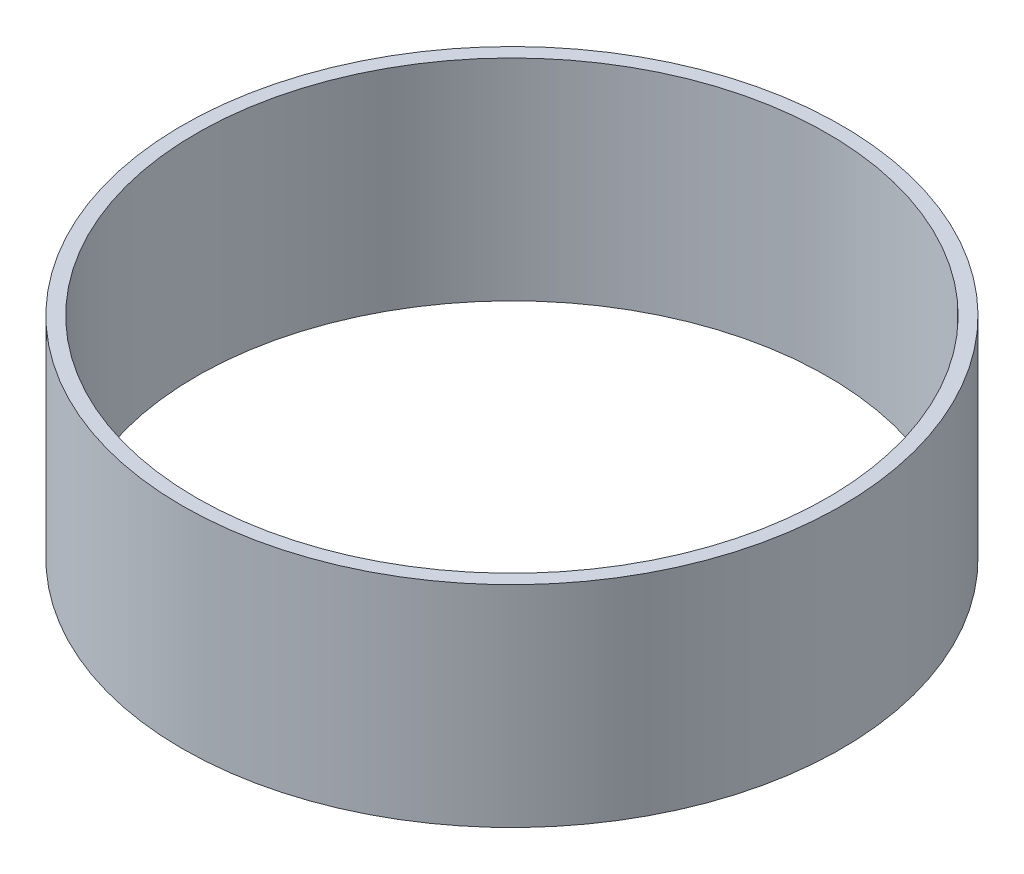
ISO-10303-21;
HEADER;
FILE_DESCRIPTION(('STEP AP214'),'2;1');
FILE_NAME('part.step','',(''),(''),'','','');
FILE_SCHEMA(('AUTOMOTIVE_DESIGN { 1 0 10303 214 1 1 1 1 }'));
ENDSEC;
DATA;
#1=APPLICATION_CONTEXT('core data for automotive mechanical design processes');
#2=APPLICATION_PROTOCOL_DEFINITION('international standard','automotive_design',2000,#1);
#3=PRODUCT_CONTEXT('',#1,'mechanical');
#4=PRODUCT('Part','Part','',(#3));
#5=PRODUCT_RELATED_PRODUCT_CATEGORY('part','',(#4));
#6=PRODUCT_DEFINITION_FORMATION('','',#4);
#7=PRODUCT_DEFINITION_CONTEXT('part definition',#1,'design');
#8=PRODUCT_DEFINITION('design','',#6,#7);
#9=PRODUCT_DEFINITION_SHAPE('','',#8);
#10=(LENGTH_UNIT() NAMED_UNIT(*) SI_UNIT(.MILLI.,.METRE.));
#11=(NAMED_UNIT(*) PLANE_ANGLE_UNIT() SI_UNIT($,.RADIAN.));
#12=(NAMED_UNIT(*) SI_UNIT($,.STERADIAN.) SOLID_ANGLE_UNIT());
#13=UNCERTAINTY_MEASURE_WITH_UNIT(LENGTH_MEASURE(1.E-05),#10,'distance_accuracy_value','');
#14=(GEOMETRIC_REPRESENTATION_CONTEXT(3) GLOBAL_UNCERTAINTY_ASSIGNED_CONTEXT((#13)) GLOBAL_UNIT_ASSIGNED_CONTEXT((#10,
#11,#12)) REPRESENTATION_CONTEXT('',''));
#15=CARTESIAN_POINT('',(0.,0.,0.));
#16=DIRECTION('',(0.,0.,1.));
#17=DIRECTION('',(1.,0.,0.));
#18=AXIS2_PLACEMENT_3D('',#15,#16,#17);
#19=CARTESIAN_POINT('',(0.,15.,0.));
#20=DIRECTION('',(0.,1.,0.));
#21=DIRECTION('',(0.,0.,1.));
#22=AXIS2_PLACEMENT_3D('',#19,#20,#21);
#23=PLANE('',#22);
#24=CARTESIAN_POINT('',(0.,15.,0.));
#25=DIRECTION('',(0.,1.,0.));
#26=DIRECTION('',(0.,0.,1.));
#27=AXIS2_PLACEMENT_3D('',#24,#25,#26);
#28=CIRCLE('',#27,23.5044);
#29=CARTESIAN_POINT('',(0.,15.,23.5044));
#30=VERTEX_POINT('',#29);
#31=EDGE_CURVE('E10',#30,#30,#28,.T.);
#32=ORIENTED_EDGE('',*,*,#31,.T.);
#33=EDGE_LOOP('',(#32));
#34=FACE_BOUND('',#33,.T.);
#35=CARTESIAN_POINT('',(0.,15.,0.));
#36=DIRECTION('',(0.,1.,0.));
#37=DIRECTION('',(0.,0.,1.));
#38=AXIS2_PLACEMENT_3D('',#35,#36,#37);
#39=CIRCLE('',#38,22.5044);
#40=CARTESIAN_POINT('',(0.,15.,22.5044));
#41=VERTEX_POINT('',#40);
#42=EDGE_CURVE('E42',#41,#41,#39,.T.);
#43=ORIENTED_EDGE('',*,*,#42,.F.);
#44=EDGE_LOOP('',(#43));
#45=FACE_BOUND('',#44,.T.);
#46=ADVANCED_FACE('F31',(#34,#45),#23,.T.);
#47=CARTESIAN_POINT('',(0.,0.,0.));
#48=DIRECTION('',(0.,1.,0.));
#49=DIRECTION('',(0.,0.,1.));
#50=AXIS2_PLACEMENT_3D('',#47,#48,#49);
#51=PLANE('',#50);
#52=CARTESIAN_POINT('',(0.,0.,0.));
#53=DIRECTION('',(0.,1.,0.));
#54=DIRECTION('',(0.,0.,1.));
#55=AXIS2_PLACEMENT_3D('',#52,#53,#54);
#56=CIRCLE('',#55,23.5044);
#57=CARTESIAN_POINT('',(0.,0.,23.5044));
#58=VERTEX_POINT('',#57);
#59=EDGE_CURVE('E35',#58,#58,#56,.T.);
#60=ORIENTED_EDGE('',*,*,#59,.F.);
#61=EDGE_LOOP('',(#60));
#62=FACE_BOUND('',#61,.T.);
#63=CARTESIAN_POINT('',(0.,0.,0.));
#64=DIRECTION('',(0.,1.,0.));
#65=DIRECTION('',(0.,0.,1.));
#66=AXIS2_PLACEMENT_3D('',#63,#64,#65);
#67=CIRCLE('',#66,22.5044);
#68=CARTESIAN_POINT('',(0.,0.,22.5044));
#69=VERTEX_POINT('',#68);
#70=EDGE_CURVE('E44',#69,#69,#67,.T.);
#71=ORIENTED_EDGE('',*,*,#70,.T.);
#72=EDGE_LOOP('',(#71));
#73=FACE_BOUND('',#72,.T.);
#74=ADVANCED_FACE('F54',(#62,#73),#51,.F.);
#75=CARTESIAN_POINT('',(0.,15.,0.));
#76=DIRECTION('',(0.,-1.,0.));
#77=DIRECTION('',(0.,0.,-1.));
#78=AXIS2_PLACEMENT_3D('',#75,#76,#77);
#79=CYLINDRICAL_SURFACE('',#78,23.5044);
#80=ORIENTED_EDGE('',*,*,#31,.F.);
#81=EDGE_LOOP('',(#80));
#82=FACE_BOUND('',#81,.T.);
#83=ORIENTED_EDGE('',*,*,#59,.T.);
#84=EDGE_LOOP('',(#83));
#85=FACE_BOUND('',#84,.T.);
#86=ADVANCED_FACE('F33',(#82,#85),#79,.T.);
#87=CARTESIAN_POINT('',(0.,15.,0.));
#88=DIRECTION('',(0.,-1.,0.));
#89=DIRECTION('',(0.,0.,-1.));
#90=AXIS2_PLACEMENT_3D('',#87,#88,#89);
#91=CYLINDRICAL_SURFACE('',#90,22.5044);
#92=ORIENTED_EDGE('',*,*,#42,.T.);
#93=EDGE_LOOP('',(#92));
#94=FACE_BOUND('',#93,.T.);
#95=ORIENTED_EDGE('',*,*,#70,.F.);
#96=EDGE_LOOP('',(#95));
#97=FACE_BOUND('',#96,.T.);
#98=ADVANCED_FACE('F50',(#94,#97),#91,.F.);
#99=CLOSED_SHELL('',(#46,#74,#86,#98));
#100=MANIFOLD_SOLID_BREP('B2',#99);
#101=ADVANCED_BREP_SHAPE_REPRESENTATION('',(#18,#100),#14);
#102=SHAPE_DEFINITION_REPRESENTATION(#9,#101);
ENDSEC;
END-ISO-10303-21;
